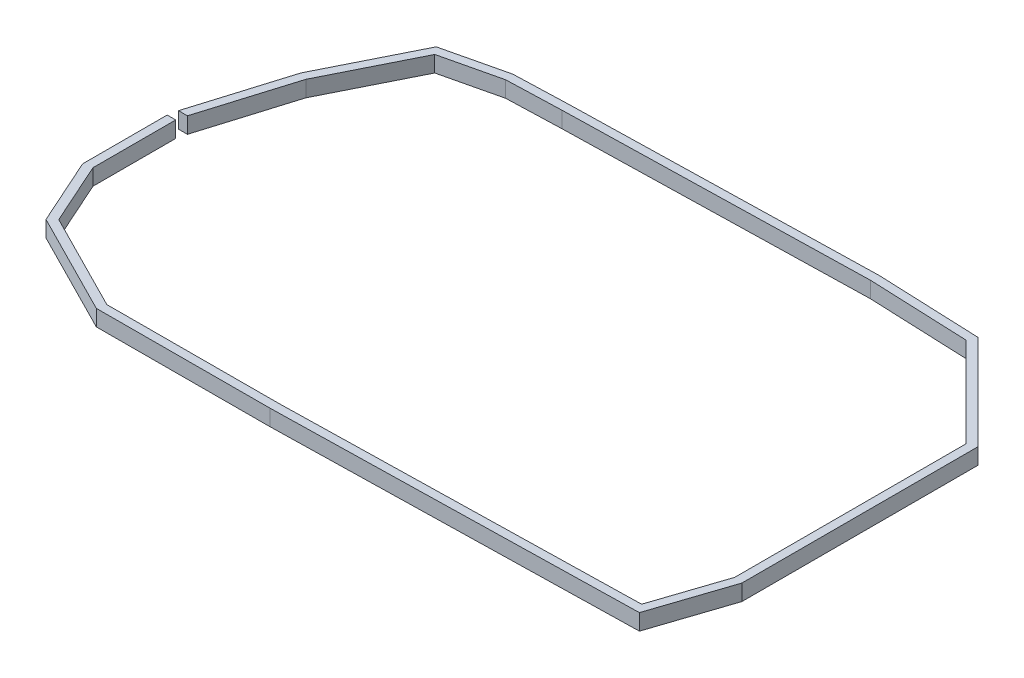
ISO-10303-21;
HEADER;
FILE_DESCRIPTION(('STEP AP214'),'2;1');
FILE_NAME('part.step','',(''),(''),'','','');
FILE_SCHEMA(('AUTOMOTIVE_DESIGN { 1 0 10303 214 1 1 1 1 }'));
ENDSEC;
DATA;
#1=APPLICATION_CONTEXT('core data for automotive mechanical design processes');
#2=APPLICATION_PROTOCOL_DEFINITION('international standard','automotive_design',2000,#1);
#3=PRODUCT_CONTEXT('',#1,'mechanical');
#4=PRODUCT('Part','Part','',(#3));
#5=PRODUCT_RELATED_PRODUCT_CATEGORY('part','',(#4));
#6=PRODUCT_DEFINITION_FORMATION('','',#4);
#7=PRODUCT_DEFINITION_CONTEXT('part definition',#1,'design');
#8=PRODUCT_DEFINITION('design','',#6,#7);
#9=PRODUCT_DEFINITION_SHAPE('','',#8);
#10=(LENGTH_UNIT() NAMED_UNIT(*) SI_UNIT(.MILLI.,.METRE.));
#11=(NAMED_UNIT(*) PLANE_ANGLE_UNIT() SI_UNIT($,.RADIAN.));
#12=(NAMED_UNIT(*) SI_UNIT($,.STERADIAN.) SOLID_ANGLE_UNIT());
#13=UNCERTAINTY_MEASURE_WITH_UNIT(LENGTH_MEASURE(1.E-05),#10,'distance_accuracy_value','');
#14=(GEOMETRIC_REPRESENTATION_CONTEXT(3) GLOBAL_UNCERTAINTY_ASSIGNED_CONTEXT((#13)) GLOBAL_UNIT_ASSIGNED_CONTEXT((#10,
#11,#12)) REPRESENTATION_CONTEXT('',''));
#15=CARTESIAN_POINT('',(0.,0.,0.));
#16=DIRECTION('',(0.,0.,1.));
#17=DIRECTION('',(1.,0.,0.));
#18=AXIS2_PLACEMENT_3D('',#15,#16,#17);
#19=CARTESIAN_POINT('',(-135.4488865865,99.55,-59.93273568796));
#20=DIRECTION('',(-0.894687808447042,0.,-0.446691980470021));
#21=DIRECTION('',(-0.446691980470021,0.,0.894687808447042));
#22=AXIS2_PLACEMENT_3D('',#19,#20,#21);
#23=PLANE('',#22);
#24=DIRECTION('',(0.,-1.,0.));
#25=VECTOR('',#24,1.);
#26=CARTESIAN_POINT('',(-135.4488865865,99.55,-59.93273568796));
#27=LINE('',#26,#25);
#28=CARTESIAN_POINT('',(-135.4488865865,99.55,-59.93273568796));
#29=VERTEX_POINT('',#28);
#30=CARTESIAN_POINT('',(-135.4488865865,94.45,-59.93273568796));
#31=VERTEX_POINT('',#30);
#32=EDGE_CURVE('E42',#29,#31,#27,.T.);
#33=ORIENTED_EDGE('',*,*,#32,.T.);
#34=DIRECTION('',(-0.446691980470021,0.,0.894687808447042));
#35=VECTOR('',#34,1.);
#36=CARTESIAN_POINT('',(-135.4488865865,94.45,-59.93273568796));
#37=LINE('',#36,#35);
#38=CARTESIAN_POINT('',(-149.7358759283,94.45,-31.31705476602));
#39=VERTEX_POINT('',#38);
#40=EDGE_CURVE('E400',#31,#39,#37,.T.);
#41=ORIENTED_EDGE('',*,*,#40,.T.);
#42=DIRECTION('',(0.,-1.,0.));
#43=VECTOR('',#42,1.);
#44=CARTESIAN_POINT('',(-149.7358759283,99.55,-31.31705476602));
#45=LINE('',#44,#43);
#46=CARTESIAN_POINT('',(-149.7358759283,99.55,-31.31705476602));
#47=VERTEX_POINT('',#46);
#48=EDGE_CURVE('E11',#47,#39,#45,.T.);
#49=ORIENTED_EDGE('',*,*,#48,.F.);
#50=DIRECTION('',(-0.446691980470021,0.,0.894687808447042));
#51=VECTOR('',#50,1.);
#52=CARTESIAN_POINT('',(-135.4488865865,99.55,-59.93273568796));
#53=LINE('',#52,#51);
#54=EDGE_CURVE('E425',#29,#47,#53,.T.);
#55=ORIENTED_EDGE('',*,*,#54,.F.);
#56=EDGE_LOOP('',(#33,#41,#49,#55));
#57=FACE_BOUND('',#56,.T.);
#58=ADVANCED_FACE('F17',(#57),#23,.T.);
#59=CARTESIAN_POINT('',(-149.7358759283,99.55,-31.31705476602));
#60=DIRECTION('',(-0.956779500675141,0.,-0.290814351585043));
#61=DIRECTION('',(-0.290814351585043,0.,0.956779500675141));
#62=AXIS2_PLACEMENT_3D('',#59,#60,#61);
#63=PLANE('',#62);
#64=DIRECTION('',(-0.290814351585043,0.,0.956779500675141));
#65=VECTOR('',#64,1.);
#66=CARTESIAN_POINT('',(-149.7358759283,99.55,-31.31705476602));
#67=LINE('',#66,#65);
#68=CARTESIAN_POINT('',(-158.7988078178,99.55,-1.5));
#69=VERTEX_POINT('',#68);
#70=EDGE_CURVE('E481',#47,#69,#67,.T.);
#71=ORIENTED_EDGE('',*,*,#70,.F.);
#72=ORIENTED_EDGE('',*,*,#48,.T.);
#73=DIRECTION('',(-0.290814351585043,0.,0.956779500675141));
#74=VECTOR('',#73,1.);
#75=CARTESIAN_POINT('',(-149.7358759283,94.45,-31.31705476602));
#76=LINE('',#75,#74);
#77=CARTESIAN_POINT('',(-158.7988078178,94.45,-1.5));
#78=VERTEX_POINT('',#77);
#79=EDGE_CURVE('E349',#39,#78,#76,.T.);
#80=ORIENTED_EDGE('',*,*,#79,.T.);
#81=DIRECTION('',(0.,1.,0.));
#82=VECTOR('',#81,1.);
#83=CARTESIAN_POINT('',(-158.7988078178,95.775,-1.5));
#84=LINE('',#83,#82);
#85=EDGE_CURVE('E28',#78,#69,#84,.T.);
#86=ORIENTED_EDGE('',*,*,#85,.T.);
#87=EDGE_LOOP('',(#71,#72,#80,#86));
#88=FACE_BOUND('',#87,.T.);
#89=ADVANCED_FACE('F735',(#88),#63,.T.);
#90=CARTESIAN_POINT('',(-162.7,92.,-1.5));
#91=DIRECTION('',(0.,0.,1.));
#92=DIRECTION('',(1.,0.,0.));
#93=AXIS2_PLACEMENT_3D('',#90,#91,#92);
#94=PLANE('',#93);
#95=DIRECTION('',(1.,0.,0.));
#96=VECTOR('',#95,1.);
#97=CARTESIAN_POINT('',(-104.2931422673,99.55,-1.5));
#98=LINE('',#97,#96);
#99=CARTESIAN_POINT('',(-155.976841003,99.55,-1.5));
#100=VERTEX_POINT('',#99);
#101=EDGE_CURVE('E366',#69,#100,#98,.T.);
#102=ORIENTED_EDGE('',*,*,#101,.F.);
#103=ORIENTED_EDGE('',*,*,#85,.F.);
#104=DIRECTION('',(1.,0.,0.));
#105=VECTOR('',#104,1.);
#106=CARTESIAN_POINT('',(-104.2931422673,94.45,-1.5));
#107=LINE('',#106,#105);
#108=CARTESIAN_POINT('',(-155.976841003,94.45,-1.5));
#109=VERTEX_POINT('',#108);
#110=EDGE_CURVE('E346',#78,#109,#107,.T.);
#111=ORIENTED_EDGE('',*,*,#110,.T.);
#112=DIRECTION('',(0.,1.,0.));
#113=VECTOR('',#112,1.);
#114=CARTESIAN_POINT('',(-155.976841003,96.275,-1.5));
#115=LINE('',#114,#113);
#116=EDGE_CURVE('E354',#109,#100,#115,.T.);
#117=ORIENTED_EDGE('',*,*,#116,.T.);
#118=EDGE_LOOP('',(#102,#103,#111,#117));
#119=FACE_BOUND('',#118,.T.);
#120=ADVANCED_FACE('F730',(#119),#94,.T.);
#121=CARTESIAN_POINT('',(-147.2186782601,100.55,-30.31436397579));
#122=DIRECTION('',(-0.956779500675141,0.,-0.290814351585043));
#123=DIRECTION('',(-0.290814351585043,0.,0.956779500675141));
#124=AXIS2_PLACEMENT_3D('',#121,#122,#123);
#125=PLANE('',#124);
#126=ORIENTED_EDGE('',*,*,#116,.F.);
#127=DIRECTION('',(-0.290814351585043,0.,0.956779500675141));
#128=VECTOR('',#127,1.);
#129=CARTESIAN_POINT('',(-147.3209530465,94.45,-29.97787982886));
#130=LINE('',#129,#128);
#131=CARTESIAN_POINT('',(-147.2186782601,94.45,-30.31436397579));
#132=VERTEX_POINT('',#131);
#133=EDGE_CURVE('E350',#132,#109,#130,.T.);
#134=ORIENTED_EDGE('',*,*,#133,.F.);
#135=DIRECTION('',(0.,-1.,0.));
#136=VECTOR('',#135,1.);
#137=CARTESIAN_POINT('',(-147.2186782601,100.55,-30.31436397579));
#138=LINE('',#137,#136);
#139=CARTESIAN_POINT('',(-147.2186782601,99.55,-30.31436397579));
#140=VERTEX_POINT('',#139);
#141=EDGE_CURVE('E475',#140,#132,#138,.T.);
#142=ORIENTED_EDGE('',*,*,#141,.F.);
#143=DIRECTION('',(-0.290814351585043,0.,0.956779500675141));
#144=VECTOR('',#143,1.);
#145=CARTESIAN_POINT('',(-147.3209530465,99.55,-29.97787982886));
#146=LINE('',#145,#144);
#147=EDGE_CURVE('E361',#140,#100,#146,.T.);
#148=ORIENTED_EDGE('',*,*,#147,.T.);
#149=EDGE_LOOP('',(#126,#134,#142,#148));
#150=FACE_BOUND('',#149,.T.);
#151=ADVANCED_FACE('F722',(#150),#125,.F.);
#152=CARTESIAN_POINT('',(-133.5979389254,100.55,-57.59560016898));
#153=DIRECTION('',(-0.894687808447042,0.,-0.446691980470021));
#154=DIRECTION('',(-0.446691980470021,0.,0.894687808447042));
#155=AXIS2_PLACEMENT_3D('',#152,#153,#154);
#156=PLANE('',#155);
#157=ORIENTED_EDGE('',*,*,#141,.T.);
#158=DIRECTION('',(-0.446691980470021,0.,0.894687808447042));
#159=VECTOR('',#158,1.);
#160=CARTESIAN_POINT('',(-136.6002232324,94.45,-51.58226819895));
#161=LINE('',#160,#159);
#162=CARTESIAN_POINT('',(-133.5979389254,94.45,-57.59560016898));
#163=VERTEX_POINT('',#162);
#164=EDGE_CURVE('E491',#163,#132,#161,.T.);
#165=ORIENTED_EDGE('',*,*,#164,.F.);
#166=DIRECTION('',(0.,-1.,0.));
#167=VECTOR('',#166,1.);
#168=CARTESIAN_POINT('',(-133.5979389254,100.55,-57.59560016898));
#169=LINE('',#168,#167);
#170=CARTESIAN_POINT('',(-133.5979389254,99.55,-57.59560016898));
#171=VERTEX_POINT('',#170);
#172=EDGE_CURVE('E439',#171,#163,#169,.T.);
#173=ORIENTED_EDGE('',*,*,#172,.F.);
#174=DIRECTION('',(-0.446691980470021,0.,0.894687808447042));
#175=VECTOR('',#174,1.);
#176=CARTESIAN_POINT('',(-136.6002232324,99.55,-51.58226819895));
#177=LINE('',#176,#175);
#178=EDGE_CURVE('E365',#171,#140,#177,.T.);
#179=ORIENTED_EDGE('',*,*,#178,.T.);
#180=EDGE_LOOP('',(#157,#165,#173,#179));
#181=FACE_BOUND('',#180,.T.);
#182=ADVANCED_FACE('F716',(#181),#156,.F.);
#183=CARTESIAN_POINT('',(-115.4049332195,100.55,-61.89227890883));
#184=DIRECTION('',(-0.229848822853935,0.,-0.973226345015722));
#185=DIRECTION('',(-0.973226345015722,0.,0.229848822853935));
#186=AXIS2_PLACEMENT_3D('',#183,#184,#185);
#187=PLANE('',#186);
#188=ORIENTED_EDGE('',*,*,#172,.T.);
#189=DIRECTION('',(-0.973226345015722,0.,0.229848822853935));
#190=VECTOR('',#189,1.);
#191=CARTESIAN_POINT('',(-89.54100842874,94.45,-68.00061403355));
#192=LINE('',#191,#190);
#193=CARTESIAN_POINT('',(-115.4049332195,94.45,-61.89227890883));
#194=VERTEX_POINT('',#193);
#195=EDGE_CURVE('E495',#194,#163,#192,.T.);
#196=ORIENTED_EDGE('',*,*,#195,.F.);
#197=DIRECTION('',(0.,-1.,0.));
#198=VECTOR('',#197,1.);
#199=CARTESIAN_POINT('',(-115.4049332195,100.55,-61.89227890883));
#200=LINE('',#199,#198);
#201=CARTESIAN_POINT('',(-115.4049332195,99.55,-61.89227890883));
#202=VERTEX_POINT('',#201);
#203=EDGE_CURVE('E430',#202,#194,#200,.T.);
#204=ORIENTED_EDGE('',*,*,#203,.F.);
#205=DIRECTION('',(-0.973226345015722,0.,0.229848822853935));
#206=VECTOR('',#205,1.);
#207=CARTESIAN_POINT('',(-89.54100842874,99.55,-68.00061403355));
#208=LINE('',#207,#206);
#209=EDGE_CURVE('E381',#202,#171,#208,.T.);
#210=ORIENTED_EDGE('',*,*,#209,.T.);
#211=EDGE_LOOP('',(#188,#196,#204,#210));
#212=FACE_BOUND('',#211,.T.);
#213=ADVANCED_FACE('F721',(#212),#187,.F.);
#214=CARTESIAN_POINT('',(-98.10585932929,100.55,-62.46753086292));
#215=DIRECTION('',(-0.0332349678904674,0.,-0.999447565862922));
#216=DIRECTION('',(-0.999447565862922,0.,0.0332349678904674));
#217=AXIS2_PLACEMENT_3D('',#214,#215,#216);
#218=PLANE('',#217);
#219=ORIENTED_EDGE('',*,*,#203,.T.);
#220=DIRECTION('',(-0.999447565862922,0.,0.0332349678904674));
#221=VECTOR('',#220,1.);
#222=CARTESIAN_POINT('',(-73.0826684528,94.45,-63.29963549122));
#223=LINE('',#222,#221);
#224=CARTESIAN_POINT('',(-98.10585932929,94.45,-62.46753086292));
#225=VERTEX_POINT('',#224);
#226=EDGE_CURVE('E490',#225,#194,#223,.T.);
#227=ORIENTED_EDGE('',*,*,#226,.F.);
#228=DIRECTION('',(0.,-1.,0.));
#229=VECTOR('',#228,1.);
#230=CARTESIAN_POINT('',(-98.10585932929,100.55,-62.46753086292));
#231=LINE('',#230,#229);
#232=CARTESIAN_POINT('',(-98.10585932929,99.55,-62.46753086292));
#233=VERTEX_POINT('',#232);
#234=EDGE_CURVE('E428',#233,#225,#231,.T.);
#235=ORIENTED_EDGE('',*,*,#234,.F.);
#236=DIRECTION('',(-0.999447565862922,0.,0.0332349678904674));
#237=VECTOR('',#236,1.);
#238=CARTESIAN_POINT('',(-73.0826684528,99.55,-63.29963549122));
#239=LINE('',#238,#237);
#240=EDGE_CURVE('E453',#233,#202,#239,.T.);
#241=ORIENTED_EDGE('',*,*,#240,.T.);
#242=EDGE_LOOP('',(#219,#227,#235,#241));
#243=FACE_BOUND('',#242,.T.);
#244=ADVANCED_FACE('F853',(#243),#218,.F.);
#245=CARTESIAN_POINT('',(-2.406146258736,100.55,-64.68618903425));
#246=DIRECTION('',(-0.0231773126798001,0.,-0.999731370007435));
#247=DIRECTION('',(-0.999731370007435,0.,0.0231773126798001));
#248=AXIS2_PLACEMENT_3D('',#245,#246,#247);
#249=PLANE('',#248);
#250=ORIENTED_EDGE('',*,*,#234,.T.);
#251=DIRECTION('',(-0.999731370007435,0.,0.0231773126798001));
#252=VECTOR('',#251,1.);
#253=CARTESIAN_POINT('',(-24.89810618916,94.45,-64.16474577086));
#254=LINE('',#253,#252);
#255=CARTESIAN_POINT('',(-2.406146258736,94.45,-64.68618903425));
#256=VERTEX_POINT('',#255);
#257=EDGE_CURVE('E395',#256,#225,#254,.T.);
#258=ORIENTED_EDGE('',*,*,#257,.F.);
#259=DIRECTION('',(0.,-1.,0.));
#260=VECTOR('',#259,1.);
#261=CARTESIAN_POINT('',(-2.406146258736,100.55,-64.68618903425));
#262=LINE('',#261,#260);
#263=CARTESIAN_POINT('',(-2.406146258736,99.55,-64.68618903425));
#264=VERTEX_POINT('',#263);
#265=EDGE_CURVE('E334',#264,#256,#262,.T.);
#266=ORIENTED_EDGE('',*,*,#265,.F.);
#267=DIRECTION('',(-0.999731370007435,0.,0.0231773126798001));
#268=VECTOR('',#267,1.);
#269=CARTESIAN_POINT('',(-24.89810618916,99.55,-64.16474577086));
#270=LINE('',#269,#268);
#271=EDGE_CURVE('E300',#264,#233,#270,.T.);
#272=ORIENTED_EDGE('',*,*,#271,.T.);
#273=EDGE_LOOP('',(#250,#258,#266,#272));
#274=FACE_BOUND('',#273,.T.);
#275=ADVANCED_FACE('F19',(#274),#249,.F.);
#276=CARTESIAN_POINT('',(29.183843396715,100.55,-63.39460921954));
#277=DIRECTION('',(0.040851600465121,0.,-0.999165224945023));
#278=DIRECTION('',(0.,-1.,0.));
#279=AXIS2_PLACEMENT_3D('',#276,#277,#278);
#280=PLANE('',#279);
#281=ORIENTED_EDGE('',*,*,#265,.T.);
#282=DIRECTION('',(-0.999165224945023,0.,-0.040851600465121));
#283=VECTOR('',#282,1.);
#284=CARTESIAN_POINT('',(-6.969858573423,94.45,-64.87277974764));
#285=LINE('',#284,#283);
#286=CARTESIAN_POINT('',(29.183843396715,94.45,-63.39460921954));
#287=VERTEX_POINT('',#286);
#288=EDGE_CURVE('E330',#287,#256,#285,.T.);
#289=ORIENTED_EDGE('',*,*,#288,.F.);
#290=DIRECTION('',(0.,-1.,0.));
#291=VECTOR('',#290,1.);
#292=CARTESIAN_POINT('',(29.183843396715,100.55,-63.39460921954));
#293=LINE('',#292,#291);
#294=CARTESIAN_POINT('',(29.183843396715,99.55,-63.39460921954));
#295=VERTEX_POINT('',#294);
#296=EDGE_CURVE('E277',#295,#287,#293,.T.);
#297=ORIENTED_EDGE('',*,*,#296,.F.);
#298=DIRECTION('',(-0.999165224945023,0.,-0.040851600465121));
#299=VECTOR('',#298,1.);
#300=CARTESIAN_POINT('',(-6.969858573423,99.55,-64.87277974764));
#301=LINE('',#300,#299);
#302=EDGE_CURVE('E292',#295,#264,#301,.T.);
#303=ORIENTED_EDGE('',*,*,#302,.T.);
#304=EDGE_LOOP('',(#281,#289,#297,#303));
#305=FACE_BOUND('',#304,.T.);
#306=ADVANCED_FACE('F839',(#305),#280,.F.);
#307=CARTESIAN_POINT('',(57.7,100.55,-34.83944865455));
#308=DIRECTION('',(0.707589870352046,0.,-0.706623361753046));
#309=DIRECTION('',(0.,-1.,0.));
#310=AXIS2_PLACEMENT_3D('',#307,#308,#309);
#311=PLANE('',#310);
#312=ORIENTED_EDGE('',*,*,#296,.T.);
#313=DIRECTION('',(-0.706623361753046,0.,-0.707589870352046));
#314=VECTOR('',#313,1.);
#315=CARTESIAN_POINT('',(40.853901305996,94.45,-51.70858918401));
#316=LINE('',#315,#314);
#317=CARTESIAN_POINT('',(57.7,94.45,-34.83944865455));
#318=VERTEX_POINT('',#317);
#319=EDGE_CURVE('E272',#318,#287,#316,.T.);
#320=ORIENTED_EDGE('',*,*,#319,.F.);
#321=DIRECTION('',(0.,-1.,0.));
#322=VECTOR('',#321,1.);
#323=CARTESIAN_POINT('',(57.7,100.55,-34.83944865455));
#324=LINE('',#323,#322);
#325=CARTESIAN_POINT('',(57.7,99.55,-34.83944865455));
#326=VERTEX_POINT('',#325);
#327=EDGE_CURVE('E265',#326,#318,#324,.T.);
#328=ORIENTED_EDGE('',*,*,#327,.F.);
#329=DIRECTION('',(-0.706623361753046,0.,-0.707589870352046));
#330=VECTOR('',#329,1.);
#331=CARTESIAN_POINT('',(40.853901305996,99.55,-51.70858918401));
#332=LINE('',#331,#330);
#333=EDGE_CURVE('E269',#326,#295,#332,.T.);
#334=ORIENTED_EDGE('',*,*,#333,.T.);
#335=EDGE_LOOP('',(#312,#320,#328,#334));
#336=FACE_BOUND('',#335,.T.);
#337=ADVANCED_FACE('F267',(#336),#311,.F.);
#338=CARTESIAN_POINT('',(57.7,100.55,38.490817760434));
#339=DIRECTION('',(1.,0.,0.));
#340=DIRECTION('',(0.,0.,1.));
#341=AXIS2_PLACEMENT_3D('',#338,#339,#340);
#342=PLANE('',#341);
#343=ORIENTED_EDGE('',*,*,#327,.T.);
#344=DIRECTION('',(0.,0.,-1.));
#345=VECTOR('',#344,1.);
#346=CARTESIAN_POINT('',(57.7,94.45,19.855852857383));
#347=LINE('',#346,#345);
#348=CARTESIAN_POINT('',(57.7,94.45,38.490817760434));
#349=VERTEX_POINT('',#348);
#350=EDGE_CURVE('E331',#349,#318,#347,.T.);
#351=ORIENTED_EDGE('',*,*,#350,.F.);
#352=DIRECTION('',(0.,-1.,0.));
#353=VECTOR('',#352,1.);
#354=CARTESIAN_POINT('',(57.7,100.55,38.490817760434));
#355=LINE('',#354,#353);
#356=CARTESIAN_POINT('',(57.7,99.55,38.490817760434));
#357=VERTEX_POINT('',#356);
#358=EDGE_CURVE('E278',#357,#349,#355,.T.);
#359=ORIENTED_EDGE('',*,*,#358,.F.);
#360=DIRECTION('',(0.,0.,-1.));
#361=VECTOR('',#360,1.);
#362=CARTESIAN_POINT('',(57.7,99.55,19.855852857383));
#363=LINE('',#362,#361);
#364=EDGE_CURVE('E281',#357,#326,#363,.T.);
#365=ORIENTED_EDGE('',*,*,#364,.T.);
#366=EDGE_LOOP('',(#343,#351,#359,#365));
#367=FACE_BOUND('',#366,.T.);
#368=ADVANCED_FACE('F282',(#367),#342,.F.);
#369=CARTESIAN_POINT('',(50.311115456139,100.55,60.657471392016));
#370=DIRECTION('',(0.948683298050514,0.,0.316227766016838));
#371=DIRECTION('',(0.,-1.,0.));
#372=AXIS2_PLACEMENT_3D('',#369,#370,#371);
#373=PLANE('',#372);
#374=ORIENTED_EDGE('',*,*,#358,.T.);
#375=DIRECTION('',(0.316227766016838,0.,-0.948683298050514));
#376=VECTOR('',#375,1.);
#377=CARTESIAN_POINT('',(54.41673297225,94.45,48.340618843684));
#378=LINE('',#377,#376);
#379=CARTESIAN_POINT('',(50.311115456139,94.45,60.657471392016));
#380=VERTEX_POINT('',#379);
#381=EDGE_CURVE('E304',#380,#349,#378,.T.);
#382=ORIENTED_EDGE('',*,*,#381,.F.);
#383=DIRECTION('',(0.,-1.,0.));
#384=VECTOR('',#383,1.);
#385=CARTESIAN_POINT('',(50.311115456139,100.55,60.657471392016));
#386=LINE('',#385,#384);
#387=CARTESIAN_POINT('',(50.311115456139,99.55,60.657471392016));
#388=VERTEX_POINT('',#387);
#389=EDGE_CURVE('E427',#388,#380,#386,.T.);
#390=ORIENTED_EDGE('',*,*,#389,.F.);
#391=DIRECTION('',(0.316227766016838,0.,-0.948683298050514));
#392=VECTOR('',#391,1.);
#393=CARTESIAN_POINT('',(54.41673297225,99.55,48.340618843684));
#394=LINE('',#393,#392);
#395=EDGE_CURVE('E287',#388,#357,#394,.T.);
#396=ORIENTED_EDGE('',*,*,#395,.T.);
#397=EDGE_LOOP('',(#374,#382,#390,#396));
#398=FACE_BOUND('',#397,.T.);
#399=ADVANCED_FACE('F665',(#398),#373,.F.);
#400=CARTESIAN_POINT('',(-62.48881534812,100.55,63.043969398318));
#401=DIRECTION('',(0.0211521767128717,0.,0.999776267682079));
#402=DIRECTION('',(0.,-1.,0.));
#403=AXIS2_PLACEMENT_3D('',#400,#401,#402);
#404=PLANE('',#403);
#405=ORIENTED_EDGE('',*,*,#389,.T.);
#406=DIRECTION('',(0.999776267682079,0.,-0.0211521767128717));
#407=VECTOR('',#406,1.);
#408=CARTESIAN_POINT('',(-53.53756396333,94.45,62.854588576616));
#409=LINE('',#408,#407);
#410=CARTESIAN_POINT('',(-62.48881534812,94.45,63.043969398318));
#411=VERTEX_POINT('',#410);
#412=EDGE_CURVE('E316',#411,#380,#409,.T.);
#413=ORIENTED_EDGE('',*,*,#412,.F.);
#414=DIRECTION('',(0.,-1.,0.));
#415=VECTOR('',#414,1.);
#416=CARTESIAN_POINT('',(-62.48881534812,100.55,63.043969398318));
#417=LINE('',#416,#415);
#418=CARTESIAN_POINT('',(-62.48881534812,99.55,63.043969398318));
#419=VERTEX_POINT('',#418);
#420=EDGE_CURVE('E420',#419,#411,#417,.T.);
#421=ORIENTED_EDGE('',*,*,#420,.F.);
#422=DIRECTION('',(0.999776267682079,0.,-0.0211521767128717));
#423=VECTOR('',#422,1.);
#424=CARTESIAN_POINT('',(-53.53756396333,99.55,62.854588576616));
#425=LINE('',#424,#423);
#426=EDGE_CURVE('E530',#419,#388,#425,.T.);
#427=ORIENTED_EDGE('',*,*,#426,.T.);
#428=EDGE_LOOP('',(#405,#413,#421,#427));
#429=FACE_BOUND('',#428,.T.);
#430=ADVANCED_FACE('F678',(#429),#404,.F.);
#431=CARTESIAN_POINT('',(-116.8772794266,100.55,63.168074159665));
#432=DIRECTION('',(0.00228181546145134,0.,0.999997396655711));
#433=DIRECTION('',(0.,-1.,0.));
#434=AXIS2_PLACEMENT_3D('',#431,#432,#433);
#435=PLANE('',#434);
#436=ORIENTED_EDGE('',*,*,#420,.T.);
#437=DIRECTION('',(0.999997396655711,0.,-0.00228181546145134));
#438=VECTOR('',#437,1.);
#439=CARTESIAN_POINT('',(-81.31129095478,94.45,63.086918925993));
#440=LINE('',#439,#438);
#441=CARTESIAN_POINT('',(-116.8772794266,94.45,63.168074159665));
#442=VERTEX_POINT('',#441);
#443=EDGE_CURVE('E312',#442,#411,#440,.T.);
#444=ORIENTED_EDGE('',*,*,#443,.F.);
#445=DIRECTION('',(0.,-1.,0.));
#446=VECTOR('',#445,1.);
#447=CARTESIAN_POINT('',(-116.8772794266,100.55,63.168074159665));
#448=LINE('',#447,#446);
#449=CARTESIAN_POINT('',(-116.8772794266,99.55,63.168074159665));
#450=VERTEX_POINT('',#449);
#451=EDGE_CURVE('E341',#450,#442,#448,.T.);
#452=ORIENTED_EDGE('',*,*,#451,.F.);
#453=DIRECTION('',(0.999997396655711,0.,-0.00228181546145134));
#454=VECTOR('',#453,1.);
#455=CARTESIAN_POINT('',(-81.31129095478,99.55,63.086918925993));
#456=LINE('',#455,#454);
#457=EDGE_CURVE('E526',#450,#419,#456,.T.);
#458=ORIENTED_EDGE('',*,*,#457,.T.);
#459=EDGE_LOOP('',(#436,#444,#452,#458));
#460=FACE_BOUND('',#459,.T.);
#461=ADVANCED_FACE('F672',(#460),#435,.F.);
#462=CARTESIAN_POINT('',(-147.8621437172,100.55,47.442556491829));
#463=DIRECTION('',(-0.452572007459911,0.,0.891727860988825));
#464=DIRECTION('',(0.,1.,0.));
#465=AXIS2_PLACEMENT_3D('',#462,#463,#464);
#466=PLANE('',#465);
#467=ORIENTED_EDGE('',*,*,#451,.T.);
#468=DIRECTION('',(0.891727860988825,0.,0.452572007459911));
#469=VECTOR('',#468,1.);
#470=CARTESIAN_POINT('',(-116.6444984382,94.45,63.286215762968));
#471=LINE('',#470,#469);
#472=CARTESIAN_POINT('',(-147.8621437172,94.45,47.442556491829));
#473=VERTEX_POINT('',#472);
#474=EDGE_CURVE('E317',#473,#442,#471,.T.);
#475=ORIENTED_EDGE('',*,*,#474,.F.);
#476=DIRECTION('',(0.,-1.,0.));
#477=VECTOR('',#476,1.);
#478=CARTESIAN_POINT('',(-147.8621437172,100.55,47.442556491829));
#479=LINE('',#478,#477);
#480=CARTESIAN_POINT('',(-147.8621437172,99.55,47.442556491829));
#481=VERTEX_POINT('',#480);
#482=EDGE_CURVE('E337',#481,#473,#479,.T.);
#483=ORIENTED_EDGE('',*,*,#482,.F.);
#484=DIRECTION('',(0.891727860988825,0.,0.452572007459911));
#485=VECTOR('',#484,1.);
#486=CARTESIAN_POINT('',(-116.6444984382,99.55,63.286215762968));
#487=LINE('',#486,#485);
#488=EDGE_CURVE('E328',#481,#450,#487,.T.);
#489=ORIENTED_EDGE('',*,*,#488,.T.);
#490=EDGE_LOOP('',(#467,#475,#483,#489));
#491=FACE_BOUND('',#490,.T.);
#492=ADVANCED_FACE('F677',(#491),#466,.F.);
#493=CARTESIAN_POINT('',(-156.7,100.55,27.758354240628));
#494=DIRECTION('',(-0.912268647108363,0.,0.409592377252163));
#495=DIRECTION('',(0.,1.,0.));
#496=AXIS2_PLACEMENT_3D('',#493,#494,#495);
#497=PLANE('',#496);
#498=ORIENTED_EDGE('',*,*,#482,.T.);
#499=DIRECTION('',(0.409592377252163,0.,0.912268647108363));
#500=VECTOR('',#499,1.);
#501=CARTESIAN_POINT('',(-152.3625898426,94.45,37.418893635354));
#502=LINE('',#501,#500);
#503=CARTESIAN_POINT('',(-156.7,94.45,27.758354240628));
#504=VERTEX_POINT('',#503);
#505=EDGE_CURVE('E388',#504,#473,#502,.T.);
#506=ORIENTED_EDGE('',*,*,#505,.F.);
#507=DIRECTION('',(0.,-1.,0.));
#508=VECTOR('',#507,1.);
#509=CARTESIAN_POINT('',(-156.7,100.55,27.758354240628));
#510=LINE('',#509,#508);
#511=CARTESIAN_POINT('',(-156.7,99.55,27.758354240628));
#512=VERTEX_POINT('',#511);
#513=EDGE_CURVE('E335',#512,#504,#510,.T.);
#514=ORIENTED_EDGE('',*,*,#513,.F.);
#515=DIRECTION('',(0.409592377252163,0.,0.912268647108363));
#516=VECTOR('',#515,1.);
#517=CARTESIAN_POINT('',(-152.3625898426,99.55,37.418893635354));
#518=LINE('',#517,#516);
#519=EDGE_CURVE('E323',#512,#481,#518,.T.);
#520=ORIENTED_EDGE('',*,*,#519,.T.);
#521=EDGE_LOOP('',(#498,#506,#514,#520));
#522=FACE_BOUND('',#521,.T.);
#523=ADVANCED_FACE('F709',(#522),#497,.F.);
#524=CARTESIAN_POINT('',(-156.7,100.55,0.87919380601));
#525=DIRECTION('',(-1.,0.,0.));
#526=DIRECTION('',(0.,0.,1.));
#527=AXIS2_PLACEMENT_3D('',#524,#525,#526);
#528=PLANE('',#527);
#529=ORIENTED_EDGE('',*,*,#513,.T.);
#530=DIRECTION('',(0.,0.,1.));
#531=VECTOR('',#530,1.);
#532=CARTESIAN_POINT('',(-156.7,94.45,1.050040880171));
#533=LINE('',#532,#531);
#534=CARTESIAN_POINT('',(-156.7,94.45,1.5));
#535=VERTEX_POINT('',#534);
#536=EDGE_CURVE('E21',#535,#504,#533,.T.);
#537=ORIENTED_EDGE('',*,*,#536,.F.);
#538=DIRECTION('',(0.,1.,0.));
#539=VECTOR('',#538,1.);
#540=CARTESIAN_POINT('',(-156.7,96.275,1.5));
#541=LINE('',#540,#539);
#542=CARTESIAN_POINT('',(-156.7,99.55,1.5));
#543=VERTEX_POINT('',#542);
#544=EDGE_CURVE('E338',#535,#543,#541,.T.);
#545=ORIENTED_EDGE('',*,*,#544,.T.);
#546=DIRECTION('',(0.,0.,1.));
#547=VECTOR('',#546,1.);
#548=CARTESIAN_POINT('',(-156.7,99.55,1.050040880171));
#549=LINE('',#548,#547);
#550=EDGE_CURVE('E327',#543,#512,#549,.T.);
#551=ORIENTED_EDGE('',*,*,#550,.T.);
#552=EDGE_LOOP('',(#529,#537,#545,#551));
#553=FACE_BOUND('',#552,.T.);
#554=ADVANCED_FACE('F742',(#553),#528,.F.);
#555=CARTESIAN_POINT('',(-162.7,92.,1.5));
#556=DIRECTION('',(0.,0.,1.));
#557=DIRECTION('',(1.,0.,0.));
#558=AXIS2_PLACEMENT_3D('',#555,#556,#557);
#559=PLANE('',#558);
#560=ORIENTED_EDGE('',*,*,#544,.F.);
#561=DIRECTION('',(1.,0.,0.));
#562=VECTOR('',#561,1.);
#563=CARTESIAN_POINT('',(-104.2931422673,94.45,1.5));
#564=LINE('',#563,#562);
#565=CARTESIAN_POINT('',(-159.4,94.45,1.5));
#566=VERTEX_POINT('',#565);
#567=EDGE_CURVE('E504',#566,#535,#564,.T.);
#568=ORIENTED_EDGE('',*,*,#567,.F.);
#569=DIRECTION('',(0.,1.,0.));
#570=VECTOR('',#569,1.);
#571=CARTESIAN_POINT('',(-159.4,95.775,1.5));
#572=LINE('',#571,#570);
#573=CARTESIAN_POINT('',(-159.4,99.55,1.5));
#574=VERTEX_POINT('',#573);
#575=EDGE_CURVE('E410',#566,#574,#572,.T.);
#576=ORIENTED_EDGE('',*,*,#575,.T.);
#577=DIRECTION('',(1.,0.,0.));
#578=VECTOR('',#577,1.);
#579=CARTESIAN_POINT('',(-104.2931422673,99.55,1.5));
#580=LINE('',#579,#578);
#581=EDGE_CURVE('E468',#574,#543,#580,.T.);
#582=ORIENTED_EDGE('',*,*,#581,.T.);
#583=EDGE_LOOP('',(#560,#568,#576,#582));
#584=FACE_BOUND('',#583,.T.);
#585=ADVANCED_FACE('F637',(#584),#559,.F.);
#586=CARTESIAN_POINT('',(-159.4,99.55,0.477922866178));
#587=DIRECTION('',(-1.,0.,0.));
#588=DIRECTION('',(0.,0.,1.));
#589=AXIS2_PLACEMENT_3D('',#586,#587,#588);
#590=PLANE('',#589);
#591=DIRECTION('',(0.,0.,1.));
#592=VECTOR('',#591,1.);
#593=CARTESIAN_POINT('',(-159.4,99.55,0.477922866178));
#594=LINE('',#593,#592);
#595=CARTESIAN_POINT('',(-159.4,99.55,28.336672261087));
#596=VERTEX_POINT('',#595);
#597=EDGE_CURVE('E387',#574,#596,#594,.T.);
#598=ORIENTED_EDGE('',*,*,#597,.F.);
#599=ORIENTED_EDGE('',*,*,#575,.F.);
#600=DIRECTION('',(0.,0.,1.));
#601=VECTOR('',#600,1.);
#602=CARTESIAN_POINT('',(-159.4,94.45,0.477922866178));
#603=LINE('',#602,#601);
#604=CARTESIAN_POINT('',(-159.4,94.45,28.336672261087));
#605=VERTEX_POINT('',#604);
#606=EDGE_CURVE('E464',#566,#605,#603,.T.);
#607=ORIENTED_EDGE('',*,*,#606,.T.);
#608=DIRECTION('',(0.,-1.,0.));
#609=VECTOR('',#608,1.);
#610=CARTESIAN_POINT('',(-159.4,99.55,28.336672261087));
#611=LINE('',#610,#609);
#612=EDGE_CURVE('E407',#596,#605,#611,.T.);
#613=ORIENTED_EDGE('',*,*,#612,.F.);
#614=EDGE_LOOP('',(#598,#599,#607,#613));
#615=FACE_BOUND('',#614,.T.);
#616=ADVANCED_FACE('F633',(#615),#590,.T.);
#617=CARTESIAN_POINT('',(-159.4,99.55,28.336672261087));
#618=DIRECTION('',(-0.912268647108363,0.,0.409592377252163));
#619=DIRECTION('',(0.,1.,0.));
#620=AXIS2_PLACEMENT_3D('',#617,#618,#619);
#621=PLANE('',#620);
#622=ORIENTED_EDGE('',*,*,#612,.T.);
#623=DIRECTION('',(0.409592377252163,0.,0.912268647108363));
#624=VECTOR('',#623,1.);
#625=CARTESIAN_POINT('',(-159.4,94.45,28.336672261087));
#626=LINE('',#625,#624);
#627=CARTESIAN_POINT('',(-149.93460562,94.45,49.418564905771));
#628=VERTEX_POINT('',#627);
#629=EDGE_CURVE('E460',#605,#628,#626,.T.);
#630=ORIENTED_EDGE('',*,*,#629,.T.);
#631=DIRECTION('',(0.,-1.,0.));
#632=VECTOR('',#631,1.);
#633=CARTESIAN_POINT('',(-149.93460562,99.55,49.418564905771));
#634=LINE('',#633,#632);
#635=CARTESIAN_POINT('',(-149.93460562,99.55,49.418564905771));
#636=VERTEX_POINT('',#635);
#637=EDGE_CURVE('E411',#636,#628,#634,.T.);
#638=ORIENTED_EDGE('',*,*,#637,.F.);
#639=DIRECTION('',(0.409592377252163,0.,0.912268647108363));
#640=VECTOR('',#639,1.);
#641=CARTESIAN_POINT('',(-159.4,99.55,28.336672261087));
#642=LINE('',#641,#640);
#643=EDGE_CURVE('E382',#596,#636,#642,.T.);
#644=ORIENTED_EDGE('',*,*,#643,.F.);
#645=EDGE_LOOP('',(#622,#630,#638,#644));
#646=FACE_BOUND('',#645,.T.);
#647=ADVANCED_FACE('F630',(#646),#621,.T.);
#648=CARTESIAN_POINT('',(-149.93460562,99.55,49.418564905771));
#649=DIRECTION('',(-0.452572007459911,0.,0.891727860988825));
#650=DIRECTION('',(0.,1.,0.));
#651=AXIS2_PLACEMENT_3D('',#648,#649,#650);
#652=PLANE('',#651);
#653=ORIENTED_EDGE('',*,*,#637,.T.);
#654=DIRECTION('',(0.891727860988825,0.,0.452572007459911));
#655=VECTOR('',#654,1.);
#656=CARTESIAN_POINT('',(-149.93460562,94.45,49.418564905771));
#657=LINE('',#656,#655);
#658=CARTESIAN_POINT('',(-117.5203153994,94.45,65.869548481957));
#659=VERTEX_POINT('',#658);
#660=EDGE_CURVE('E465',#628,#659,#657,.T.);
#661=ORIENTED_EDGE('',*,*,#660,.T.);
#662=DIRECTION('',(0.,-1.,0.));
#663=VECTOR('',#662,1.);
#664=CARTESIAN_POINT('',(-117.5203153994,99.55,65.869548481957));
#665=LINE('',#664,#663);
#666=CARTESIAN_POINT('',(-117.5203153994,99.55,65.869548481957));
#667=VERTEX_POINT('',#666);
#668=EDGE_CURVE('E573',#667,#659,#665,.T.);
#669=ORIENTED_EDGE('',*,*,#668,.F.);
#670=DIRECTION('',(0.891727860988825,0.,0.452572007459911));
#671=VECTOR('',#670,1.);
#672=CARTESIAN_POINT('',(-149.93460562,99.55,49.418564905771));
#673=LINE('',#672,#671);
#674=EDGE_CURVE('E386',#636,#667,#673,.T.);
#675=ORIENTED_EDGE('',*,*,#674,.F.);
#676=EDGE_LOOP('',(#653,#661,#669,#675));
#677=FACE_BOUND('',#676,.T.);
#678=ADVANCED_FACE('F626',(#677),#652,.T.);
#679=CARTESIAN_POINT('',(-117.5203153994,99.55,65.869548481957));
#680=DIRECTION('',(0.00228181546145134,0.,0.999997396655711));
#681=DIRECTION('',(0.,-1.,0.));
#682=AXIS2_PLACEMENT_3D('',#679,#680,#681);
#683=PLANE('',#682);
#684=ORIENTED_EDGE('',*,*,#668,.T.);
#685=DIRECTION('',(0.999997396655711,0.,-0.00228181546145134));
#686=VECTOR('',#685,1.);
#687=CARTESIAN_POINT('',(-117.5203153994,94.45,65.869548481957));
#688=LINE('',#687,#686);
#689=CARTESIAN_POINT('',(-62.45717664174,94.45,65.743904233489));
#690=VERTEX_POINT('',#689);
#691=EDGE_CURVE('E310',#659,#690,#688,.T.);
#692=ORIENTED_EDGE('',*,*,#691,.T.);
#693=DIRECTION('',(0.,-1.,0.));
#694=VECTOR('',#693,1.);
#695=CARTESIAN_POINT('',(-62.45717664174,99.55,65.743904233489));
#696=LINE('',#695,#694);
#697=CARTESIAN_POINT('',(-62.45717664174,99.55,65.743904233489));
#698=VERTEX_POINT('',#697);
#699=EDGE_CURVE('E474',#698,#690,#696,.T.);
#700=ORIENTED_EDGE('',*,*,#699,.F.);
#701=DIRECTION('',(0.999997396655711,0.,-0.00228181546145134));
#702=VECTOR('',#701,1.);
#703=CARTESIAN_POINT('',(-117.5203153994,99.55,65.869548481957));
#704=LINE('',#703,#702);
#705=EDGE_CURVE('E459',#667,#698,#704,.T.);
#706=ORIENTED_EDGE('',*,*,#705,.F.);
#707=EDGE_LOOP('',(#684,#692,#700,#706));
#708=FACE_BOUND('',#707,.T.);
#709=ADVANCED_FACE('F611',(#708),#683,.T.);
#710=CARTESIAN_POINT('',(-62.45717664174,99.55,65.743904233489));
#711=DIRECTION('',(0.0211521767128717,0.,0.999776267682079));
#712=DIRECTION('',(0.,-1.,0.));
#713=AXIS2_PLACEMENT_3D('',#710,#711,#712);
#714=PLANE('',#713);
#715=ORIENTED_EDGE('',*,*,#699,.T.);
#716=DIRECTION('',(0.999776267682079,0.,-0.0211521767128717));
#717=VECTOR('',#716,1.);
#718=CARTESIAN_POINT('',(-62.45717664174,94.45,65.743904233489));
#719=LINE('',#718,#717);
#720=CARTESIAN_POINT('',(52.270784124153,94.45,63.31661507043));
#721=VERTEX_POINT('',#720);
#722=EDGE_CURVE('E306',#690,#721,#719,.T.);
#723=ORIENTED_EDGE('',*,*,#722,.T.);
#724=DIRECTION('',(0.,-1.,0.));
#725=VECTOR('',#724,1.);
#726=CARTESIAN_POINT('',(52.270784124153,99.55,63.31661507043));
#727=LINE('',#726,#725);
#728=CARTESIAN_POINT('',(52.270784124153,99.55,63.31661507043));
#729=VERTEX_POINT('',#728);
#730=EDGE_CURVE('E406',#729,#721,#727,.T.);
#731=ORIENTED_EDGE('',*,*,#730,.F.);
#732=DIRECTION('',(0.999776267682079,0.,-0.0211521767128717));
#733=VECTOR('',#732,1.);
#734=CARTESIAN_POINT('',(-62.45717664174,99.55,65.743904233489));
#735=LINE('',#734,#733);
#736=EDGE_CURVE('E455',#698,#729,#735,.T.);
#737=ORIENTED_EDGE('',*,*,#736,.F.);
#738=EDGE_LOOP('',(#715,#723,#731,#737));
#739=FACE_BOUND('',#738,.T.);
#740=ADVANCED_FACE('F605',(#739),#714,.T.);
#741=CARTESIAN_POINT('',(52.270784124153,99.55,63.31661507043));
#742=DIRECTION('',(0.948683298050514,0.,0.316227766016838));
#743=DIRECTION('',(0.,-1.,0.));
#744=AXIS2_PLACEMENT_3D('',#741,#742,#743);
#745=PLANE('',#744);
#746=ORIENTED_EDGE('',*,*,#730,.T.);
#747=DIRECTION('',(0.316227766016838,0.,-0.948683298050514));
#748=VECTOR('',#747,1.);
#749=CARTESIAN_POINT('',(52.270784124153,94.45,63.31661507043));
#750=LINE('',#749,#748);
#751=CARTESIAN_POINT('',(60.4,94.45,38.928967442889));
#752=VERTEX_POINT('',#751);
#753=EDGE_CURVE('E311',#721,#752,#750,.T.);
#754=ORIENTED_EDGE('',*,*,#753,.T.);
#755=DIRECTION('',(0.,-1.,0.));
#756=VECTOR('',#755,1.);
#757=CARTESIAN_POINT('',(60.4,99.55,38.928967442889));
#758=LINE('',#757,#756);
#759=CARTESIAN_POINT('',(60.4,99.55,38.928967442889));
#760=VERTEX_POINT('',#759);
#761=EDGE_CURVE('E403',#760,#752,#758,.T.);
#762=ORIENTED_EDGE('',*,*,#761,.F.);
#763=DIRECTION('',(0.316227766016838,0.,-0.948683298050514));
#764=VECTOR('',#763,1.);
#765=CARTESIAN_POINT('',(52.270784124153,99.55,63.31661507043));
#766=LINE('',#765,#764);
#767=EDGE_CURVE('E417',#729,#760,#766,.T.);
#768=ORIENTED_EDGE('',*,*,#767,.F.);
#769=EDGE_LOOP('',(#746,#754,#762,#768));
#770=FACE_BOUND('',#769,.T.);
#771=ADVANCED_FACE('F618',(#770),#745,.T.);
#772=CARTESIAN_POINT('',(60.4,99.55,38.928967442889));
#773=DIRECTION('',(1.,0.,0.));
#774=DIRECTION('',(0.,0.,1.));
#775=AXIS2_PLACEMENT_3D('',#772,#773,#774);
#776=PLANE('',#775);
#777=ORIENTED_EDGE('',*,*,#761,.T.);
#778=DIRECTION('',(0.,0.,-1.));
#779=VECTOR('',#778,1.);
#780=CARTESIAN_POINT('',(60.4,94.45,38.928967442889));
#781=LINE('',#780,#779);
#782=CARTESIAN_POINT('',(60.4,94.45,-35.95674450518));
#783=VERTEX_POINT('',#782);
#784=EDGE_CURVE('E318',#752,#783,#781,.T.);
#785=ORIENTED_EDGE('',*,*,#784,.T.);
#786=DIRECTION('',(0.,-1.,0.));
#787=VECTOR('',#786,1.);
#788=CARTESIAN_POINT('',(60.4,99.55,-35.95674450518));
#789=LINE('',#788,#787);
#790=CARTESIAN_POINT('',(60.4,99.55,-35.95674450518));
#791=VERTEX_POINT('',#790);
#792=EDGE_CURVE('E399',#791,#783,#789,.T.);
#793=ORIENTED_EDGE('',*,*,#792,.F.);
#794=DIRECTION('',(0.,0.,-1.));
#795=VECTOR('',#794,1.);
#796=CARTESIAN_POINT('',(60.4,99.55,38.928967442889));
#797=LINE('',#796,#795);
#798=EDGE_CURVE('E412',#760,#791,#797,.T.);
#799=ORIENTED_EDGE('',*,*,#798,.F.);
#800=EDGE_LOOP('',(#777,#785,#793,#799));
#801=FACE_BOUND('',#800,.T.);
#802=ADVANCED_FACE('F652',(#801),#776,.T.);
#803=CARTESIAN_POINT('',(-115.7636244745,99.55,-64.58184362385));
#804=DIRECTION('',(-0.229848822853935,0.,-0.973226345015722));
#805=DIRECTION('',(-0.973226345015722,0.,0.229848822853935));
#806=AXIS2_PLACEMENT_3D('',#803,#804,#805);
#807=PLANE('',#806);
#808=DIRECTION('',(0.,-1.,0.));
#809=VECTOR('',#808,1.);
#810=CARTESIAN_POINT('',(-115.7636244745,99.55,-64.58184362385));
#811=LINE('',#810,#809);
#812=CARTESIAN_POINT('',(-115.7636244745,99.55,-64.58184362385));
#813=VERTEX_POINT('',#812);
#814=CARTESIAN_POINT('',(-115.7636244745,94.45,-64.58184362385));
#815=VERTEX_POINT('',#814);
#816=EDGE_CURVE('E372',#813,#815,#811,.T.);
#817=ORIENTED_EDGE('',*,*,#816,.T.);
#818=DIRECTION('',(-0.973226345015722,0.,0.229848822853935));
#819=VECTOR('',#818,1.);
#820=CARTESIAN_POINT('',(-115.7636244745,94.45,-64.58184362385));
#821=LINE('',#820,#819);
#822=EDGE_CURVE('E396',#815,#31,#821,.T.);
#823=ORIENTED_EDGE('',*,*,#822,.T.);
#824=ORIENTED_EDGE('',*,*,#32,.F.);
#825=DIRECTION('',(-0.973226345015722,0.,0.229848822853935));
#826=VECTOR('',#825,1.);
#827=CARTESIAN_POINT('',(-115.7636244745,99.55,-64.58184362385));
#828=LINE('',#827,#826);
#829=EDGE_CURVE('E421',#813,#29,#828,.T.);
#830=ORIENTED_EDGE('',*,*,#829,.F.);
#831=EDGE_LOOP('',(#817,#823,#824,#830));
#832=FACE_BOUND('',#831,.T.);
#833=ADVANCED_FACE('F646',(#832),#807,.T.);
#834=CARTESIAN_POINT('',(60.4,99.55,-35.95674450518));
#835=DIRECTION('',(0.707589870352046,0.,-0.706623361753046));
#836=DIRECTION('',(0.,-1.,0.));
#837=AXIS2_PLACEMENT_3D('',#834,#835,#836);
#838=PLANE('',#837);
#839=ORIENTED_EDGE('',*,*,#792,.T.);
#840=DIRECTION('',(-0.706623361753046,0.,-0.707589870352046));
#841=VECTOR('',#840,1.);
#842=CARTESIAN_POINT('',(60.4,94.45,-35.95674450518));
#843=LINE('',#842,#841);
#844=CARTESIAN_POINT('',(30.348605496204,94.45,-66.04924284554));
#845=VERTEX_POINT('',#844);
#846=EDGE_CURVE('E322',#783,#845,#843,.T.);
#847=ORIENTED_EDGE('',*,*,#846,.T.);
#848=DIRECTION('',(0.,-1.,0.));
#849=VECTOR('',#848,1.);
#850=CARTESIAN_POINT('',(30.348605496204,99.55,-66.04924284554));
#851=LINE('',#850,#849);
#852=CARTESIAN_POINT('',(30.348605496204,99.55,-66.04924284554));
#853=VERTEX_POINT('',#852);
#854=EDGE_CURVE('E371',#853,#845,#851,.T.);
#855=ORIENTED_EDGE('',*,*,#854,.F.);
#856=DIRECTION('',(-0.706623361753046,0.,-0.707589870352046));
#857=VECTOR('',#856,1.);
#858=CARTESIAN_POINT('',(60.4,99.55,-35.95674450518));
#859=LINE('',#858,#857);
#860=EDGE_CURVE('E416',#791,#853,#859,.T.);
#861=ORIENTED_EDGE('',*,*,#860,.F.);
#862=EDGE_LOOP('',(#839,#847,#855,#861));
#863=FACE_BOUND('',#862,.T.);
#864=ADVANCED_FACE('F651',(#863),#838,.T.);
#865=CARTESIAN_POINT('',(-45.8862845347,94.45,1.220887954331));
#866=DIRECTION('',(0.,1.,0.));
#867=DIRECTION('',(1.,0.,0.));
#868=AXIS2_PLACEMENT_3D('',#865,#866,#867);
#869=PLANE('',#868);
#870=ORIENTED_EDGE('',*,*,#846,.F.);
#871=ORIENTED_EDGE('',*,*,#784,.F.);
#872=ORIENTED_EDGE('',*,*,#753,.F.);
#873=ORIENTED_EDGE('',*,*,#722,.F.);
#874=ORIENTED_EDGE('',*,*,#691,.F.);
#875=ORIENTED_EDGE('',*,*,#660,.F.);
#876=ORIENTED_EDGE('',*,*,#629,.F.);
#877=ORIENTED_EDGE('',*,*,#606,.F.);
#878=ORIENTED_EDGE('',*,*,#567,.T.);
#879=ORIENTED_EDGE('',*,*,#536,.T.);
#880=ORIENTED_EDGE('',*,*,#505,.T.);
#881=ORIENTED_EDGE('',*,*,#474,.T.);
#882=ORIENTED_EDGE('',*,*,#443,.T.);
#883=ORIENTED_EDGE('',*,*,#412,.T.);
#884=ORIENTED_EDGE('',*,*,#381,.T.);
#885=ORIENTED_EDGE('',*,*,#350,.T.);
#886=ORIENTED_EDGE('',*,*,#319,.T.);
#887=ORIENTED_EDGE('',*,*,#288,.T.);
#888=ORIENTED_EDGE('',*,*,#257,.T.);
#889=ORIENTED_EDGE('',*,*,#226,.T.);
#890=ORIENTED_EDGE('',*,*,#195,.T.);
#891=ORIENTED_EDGE('',*,*,#164,.T.);
#892=ORIENTED_EDGE('',*,*,#133,.T.);
#893=ORIENTED_EDGE('',*,*,#110,.F.);
#894=ORIENTED_EDGE('',*,*,#79,.F.);
#895=ORIENTED_EDGE('',*,*,#40,.F.);
#896=ORIENTED_EDGE('',*,*,#822,.F.);
#897=DIRECTION('',(-0.999447565862922,0.,0.0332349678904674));
#898=VECTOR('',#897,1.);
#899=CARTESIAN_POINT('',(-98.18201783557,94.45,-65.16649073498));
#900=LINE('',#899,#898);
#901=CARTESIAN_POINT('',(-98.18201783557,94.45,-65.16649073498));
#902=VERTEX_POINT('',#901);
#903=EDGE_CURVE('E377',#902,#815,#900,.T.);
#904=ORIENTED_EDGE('',*,*,#903,.F.);
#905=DIRECTION('',(-0.999731370007435,0.,0.0231773126798001));
#906=VECTOR('',#905,1.);
#907=CARTESIAN_POINT('',(-2.382261488203,94.45,-67.38746826366));
#908=LINE('',#907,#906);
#909=CARTESIAN_POINT('',(-2.382261488203,94.45,-67.38746826366));
#910=VERTEX_POINT('',#909);
#911=EDGE_CURVE('E355',#910,#902,#908,.T.);
#912=ORIENTED_EDGE('',*,*,#911,.F.);
#913=DIRECTION('',(-0.999165224945023,0.,-0.040851600465121));
#914=VECTOR('',#913,1.);
#915=CARTESIAN_POINT('',(30.348605496204,94.45,-66.04924284554));
#916=LINE('',#915,#914);
#917=EDGE_CURVE('E508',#845,#910,#916,.T.);
#918=ORIENTED_EDGE('',*,*,#917,.F.);
#919=EDGE_LOOP('',(#870,#871,#872,#873,#874,#875,#876,#877,#878,#879,#880,#881,#882,#883,#884,
#885,#886,#887,#888,#889,#890,#891,#892,#893,#894,#895,#896,#904,#912,#918));
#920=FACE_BOUND('',#919,.T.);
#921=ADVANCED_FACE('F615',(#920),#869,.F.);
#922=CARTESIAN_POINT('',(-45.8862845347,99.55,1.220887954331));
#923=DIRECTION('',(0.,1.,0.));
#924=DIRECTION('',(1.,0.,0.));
#925=AXIS2_PLACEMENT_3D('',#922,#923,#924);
#926=PLANE('',#925);
#927=DIRECTION('',(-0.999165224945023,0.,-0.040851600465121));
#928=VECTOR('',#927,1.);
#929=CARTESIAN_POINT('',(30.348605496204,99.55,-66.04924284554));
#930=LINE('',#929,#928);
#931=CARTESIAN_POINT('',(-2.382261488203,99.55,-67.38746826366));
#932=VERTEX_POINT('',#931);
#933=EDGE_CURVE('E503',#853,#932,#930,.T.);
#934=ORIENTED_EDGE('',*,*,#933,.T.);
#935=DIRECTION('',(-0.999731370007435,0.,0.0231773126798001));
#936=VECTOR('',#935,1.);
#937=CARTESIAN_POINT('',(-2.382261488203,99.55,-67.38746826366));
#938=LINE('',#937,#936);
#939=CARTESIAN_POINT('',(-98.18201783557,99.55,-65.16649073498));
#940=VERTEX_POINT('',#939);
#941=EDGE_CURVE('E367',#932,#940,#938,.T.);
#942=ORIENTED_EDGE('',*,*,#941,.T.);
#943=DIRECTION('',(-0.999447565862922,0.,0.0332349678904674));
#944=VECTOR('',#943,1.);
#945=CARTESIAN_POINT('',(-98.18201783557,99.55,-65.16649073498));
#946=LINE('',#945,#944);
#947=EDGE_CURVE('E376',#940,#813,#946,.T.);
#948=ORIENTED_EDGE('',*,*,#947,.T.);
#949=ORIENTED_EDGE('',*,*,#829,.T.);
#950=ORIENTED_EDGE('',*,*,#54,.T.);
#951=ORIENTED_EDGE('',*,*,#70,.T.);
#952=ORIENTED_EDGE('',*,*,#101,.T.);
#953=ORIENTED_EDGE('',*,*,#147,.F.);
#954=ORIENTED_EDGE('',*,*,#178,.F.);
#955=ORIENTED_EDGE('',*,*,#209,.F.);
#956=ORIENTED_EDGE('',*,*,#240,.F.);
#957=ORIENTED_EDGE('',*,*,#271,.F.);
#958=ORIENTED_EDGE('',*,*,#302,.F.);
#959=ORIENTED_EDGE('',*,*,#333,.F.);
#960=ORIENTED_EDGE('',*,*,#364,.F.);
#961=ORIENTED_EDGE('',*,*,#395,.F.);
#962=ORIENTED_EDGE('',*,*,#426,.F.);
#963=ORIENTED_EDGE('',*,*,#457,.F.);
#964=ORIENTED_EDGE('',*,*,#488,.F.);
#965=ORIENTED_EDGE('',*,*,#519,.F.);
#966=ORIENTED_EDGE('',*,*,#550,.F.);
#967=ORIENTED_EDGE('',*,*,#581,.F.);
#968=ORIENTED_EDGE('',*,*,#597,.T.);
#969=ORIENTED_EDGE('',*,*,#643,.T.);
#970=ORIENTED_EDGE('',*,*,#674,.T.);
#971=ORIENTED_EDGE('',*,*,#705,.T.);
#972=ORIENTED_EDGE('',*,*,#736,.T.);
#973=ORIENTED_EDGE('',*,*,#767,.T.);
#974=ORIENTED_EDGE('',*,*,#798,.T.);
#975=ORIENTED_EDGE('',*,*,#860,.T.);
#976=EDGE_LOOP('',(#934,#942,#948,#949,#950,#951,#952,#953,#954,#955,#956,#957,#958,#959,#960,
#961,#962,#963,#964,#965,#966,#967,#968,#969,#970,#971,#972,#973,#974,#975));
#977=FACE_BOUND('',#976,.T.);
#978=ADVANCED_FACE('F289',(#977),#926,.T.);
#979=CARTESIAN_POINT('',(-98.18201783557,99.55,-65.16649073498));
#980=DIRECTION('',(-0.0332349678904674,0.,-0.999447565862922));
#981=DIRECTION('',(-0.999447565862922,0.,0.0332349678904674));
#982=AXIS2_PLACEMENT_3D('',#979,#980,#981);
#983=PLANE('',#982);
#984=DIRECTION('',(0.,-1.,0.));
#985=VECTOR('',#984,1.);
#986=CARTESIAN_POINT('',(-98.18201783557,99.55,-65.16649073498));
#987=LINE('',#986,#985);
#988=EDGE_CURVE('E359',#940,#902,#987,.T.);
#989=ORIENTED_EDGE('',*,*,#988,.T.);
#990=ORIENTED_EDGE('',*,*,#903,.T.);
#991=ORIENTED_EDGE('',*,*,#816,.F.);
#992=ORIENTED_EDGE('',*,*,#947,.F.);
#993=EDGE_LOOP('',(#989,#990,#991,#992));
#994=FACE_BOUND('',#993,.T.);
#995=ADVANCED_FACE('F766',(#994),#983,.T.);
#996=CARTESIAN_POINT('',(30.348605496204,99.55,-66.04924284554));
#997=DIRECTION('',(0.040851600465121,0.,-0.999165224945023));
#998=DIRECTION('',(0.,-1.,0.));
#999=AXIS2_PLACEMENT_3D('',#996,#997,#998);
#1000=PLANE('',#999);
#1001=ORIENTED_EDGE('',*,*,#854,.T.);
#1002=ORIENTED_EDGE('',*,*,#917,.T.);
#1003=DIRECTION('',(0.,-1.,0.));
#1004=VECTOR('',#1003,1.);
#1005=CARTESIAN_POINT('',(-2.382261488203,99.55,-67.38746826366));
#1006=LINE('',#1005,#1004);
#1007=EDGE_CURVE('E360',#932,#910,#1006,.T.);
#1008=ORIENTED_EDGE('',*,*,#1007,.F.);
#1009=ORIENTED_EDGE('',*,*,#933,.F.);
#1010=EDGE_LOOP('',(#1001,#1002,#1008,#1009));
#1011=FACE_BOUND('',#1010,.T.);
#1012=ADVANCED_FACE('F771',(#1011),#1000,.T.);
#1013=CARTESIAN_POINT('',(-2.382261488203,99.55,-67.38746826366));
#1014=DIRECTION('',(-0.0231773126798001,0.,-0.999731370007435));
#1015=DIRECTION('',(-0.999731370007435,0.,0.0231773126798001));
#1016=AXIS2_PLACEMENT_3D('',#1013,#1014,#1015);
#1017=PLANE('',#1016);
#1018=ORIENTED_EDGE('',*,*,#1007,.T.);
#1019=ORIENTED_EDGE('',*,*,#911,.T.);
#1020=ORIENTED_EDGE('',*,*,#988,.F.);
#1021=ORIENTED_EDGE('',*,*,#941,.F.);
#1022=EDGE_LOOP('',(#1018,#1019,#1020,#1021));
#1023=FACE_BOUND('',#1022,.T.);
#1024=ADVANCED_FACE('F821',(#1023),#1017,.T.);
#1025=CLOSED_SHELL('',(#58,#89,#120,#151,#182,#213,#244,#275,#306,#337,#368,#399,#430,#461,#492,
#523,#554,#585,#616,#647,#678,#709,#740,#771,#802,#833,#864,#921,#978,#995,#1012,#1024));
#1026=MANIFOLD_SOLID_BREP('B1',#1025);
#1027=ADVANCED_BREP_SHAPE_REPRESENTATION('',(#18,#1026),#14);
#1028=SHAPE_DEFINITION_REPRESENTATION(#9,#1027);
ENDSEC;
END-ISO-10303-21;
